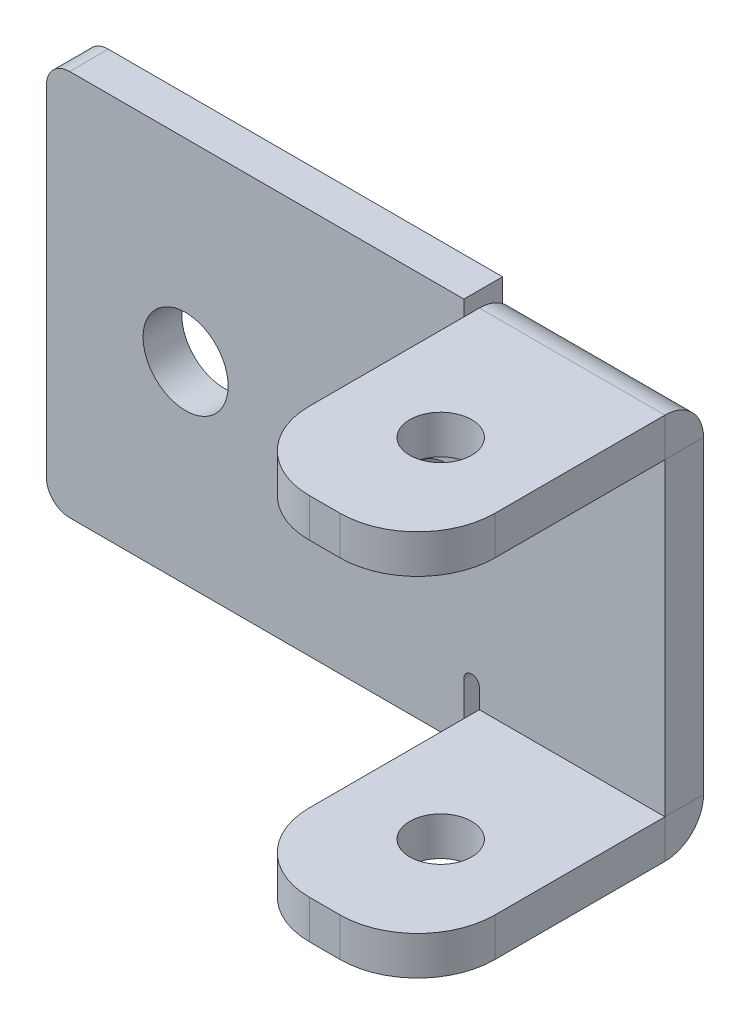
ISO-10303-21;
HEADER;
FILE_DESCRIPTION(('STEP AP214'),'2;1');
FILE_NAME('part.step','',(''),(''),'','','');
FILE_SCHEMA(('AUTOMOTIVE_DESIGN { 1 0 10303 214 1 1 1 1 }'));
ENDSEC;
DATA;
#1=APPLICATION_CONTEXT('core data for automotive mechanical design processes');
#2=APPLICATION_PROTOCOL_DEFINITION('international standard','automotive_design',2000,#1);
#3=PRODUCT_CONTEXT('',#1,'mechanical');
#4=PRODUCT('Part','Part','',(#3));
#5=PRODUCT_RELATED_PRODUCT_CATEGORY('part','',(#4));
#6=PRODUCT_DEFINITION_FORMATION('','',#4);
#7=PRODUCT_DEFINITION_CONTEXT('part definition',#1,'design');
#8=PRODUCT_DEFINITION('design','',#6,#7);
#9=PRODUCT_DEFINITION_SHAPE('','',#8);
#10=(LENGTH_UNIT() NAMED_UNIT(*) SI_UNIT(.MILLI.,.METRE.));
#11=(NAMED_UNIT(*) PLANE_ANGLE_UNIT() SI_UNIT($,.RADIAN.));
#12=(NAMED_UNIT(*) SI_UNIT($,.STERADIAN.) SOLID_ANGLE_UNIT());
#13=UNCERTAINTY_MEASURE_WITH_UNIT(LENGTH_MEASURE(1.E-05),#10,'distance_accuracy_value','');
#14=(GEOMETRIC_REPRESENTATION_CONTEXT(3) GLOBAL_UNCERTAINTY_ASSIGNED_CONTEXT((#13)) GLOBAL_UNIT_ASSIGNED_CONTEXT((#10,
#11,#12)) REPRESENTATION_CONTEXT('',''));
#15=CARTESIAN_POINT('',(0.,0.,0.));
#16=DIRECTION('',(0.,0.,1.));
#17=DIRECTION('',(1.,0.,0.));
#18=AXIS2_PLACEMENT_3D('',#15,#16,#17);
#19=CARTESIAN_POINT('',(20.,-12.5000000000001,16.));
#20=DIRECTION('',(-1.,0.,0.));
#21=DIRECTION('',(0.,0.,1.));
#22=AXIS2_PLACEMENT_3D('',#19,#20,#21);
#23=PLANE('',#22);
#24=DIRECTION('',(0.,-1.,0.));
#25=VECTOR('',#24,1.);
#26=CARTESIAN_POINT('',(20.,12.5,11.0000000000001));
#27=LINE('',#26,#25);
#28=CARTESIAN_POINT('',(20.,-10.,11.));
#29=VERTEX_POINT('',#28);
#30=CARTESIAN_POINT('',(20.,-12.5,11.));
#31=VERTEX_POINT('',#30);
#32=EDGE_CURVE('E93',#29,#31,#27,.T.);
#33=ORIENTED_EDGE('',*,*,#32,.T.);
#34=DIRECTION('',(0.,0.,1.));
#35=VECTOR('',#34,1.);
#36=CARTESIAN_POINT('',(20.,-12.5,0.));
#37=LINE('',#36,#35);
#38=CARTESIAN_POINT('',(20.,-12.5,0.));
#39=VERTEX_POINT('',#38);
#40=EDGE_CURVE('E310',#39,#31,#37,.T.);
#41=ORIENTED_EDGE('',*,*,#40,.F.);
#42=DIRECTION('',(0.,1.,0.));
#43=VECTOR('',#42,1.);
#44=CARTESIAN_POINT('',(20.,-12.5,0.));
#45=LINE('',#44,#43);
#46=CARTESIAN_POINT('',(20.,-10.,0.));
#47=VERTEX_POINT('',#46);
#48=EDGE_CURVE('E304',#39,#47,#45,.T.);
#49=ORIENTED_EDGE('',*,*,#48,.T.);
#50=DIRECTION('',(0.,0.,-1.));
#51=VECTOR('',#50,1.);
#52=CARTESIAN_POINT('',(20.,-10.0000000000001,16.));
#53=LINE('',#52,#51);
#54=EDGE_CURVE('E321',#47,#29,#53,.F.);
#55=ORIENTED_EDGE('',*,*,#54,.T.);
#56=EDGE_LOOP('',(#33,#41,#49,#55));
#57=FACE_BOUND('',#56,.T.);
#58=ADVANCED_FACE('F78',(#57),#23,.F.);
#59=CARTESIAN_POINT('',(7.99999999999999,-12.5000000000001,16.));
#60=DIRECTION('',(0.,0.,-1.));
#61=DIRECTION('',(0.,1.,0.));
#62=AXIS2_PLACEMENT_3D('',#59,#60,#61);
#63=PLANE('',#62);
#64=DIRECTION('',(0.,-1.,0.));
#65=VECTOR('',#64,1.);
#66=CARTESIAN_POINT('',(13.,12.4999999999999,16.0000000000001));
#67=LINE('',#66,#65);
#68=CARTESIAN_POINT('',(13.,-10.0000000000001,16.));
#69=VERTEX_POINT('',#68);
#70=CARTESIAN_POINT('',(13.,-12.5000000000001,16.));
#71=VERTEX_POINT('',#70);
#72=EDGE_CURVE('E101',#69,#71,#67,.T.);
#73=ORIENTED_EDGE('',*,*,#72,.T.);
#74=DIRECTION('',(-1.,0.,0.));
#75=VECTOR('',#74,1.);
#76=CARTESIAN_POINT('',(0.,-12.5000000000001,16.));
#77=LINE('',#76,#75);
#78=CARTESIAN_POINT('',(15.,-12.5000000000001,16.));
#79=VERTEX_POINT('',#78);
#80=EDGE_CURVE('E307',#79,#71,#77,.T.);
#81=ORIENTED_EDGE('',*,*,#80,.F.);
#82=DIRECTION('',(0.,-1.,0.));
#83=VECTOR('',#82,1.);
#84=CARTESIAN_POINT('',(15.,12.4999999999999,16.0000000000001));
#85=LINE('',#84,#83);
#86=CARTESIAN_POINT('',(15.,-10.0000000000001,16.));
#87=VERTEX_POINT('',#86);
#88=EDGE_CURVE('E454',#87,#79,#85,.T.);
#89=ORIENTED_EDGE('',*,*,#88,.F.);
#90=DIRECTION('',(1.,0.,0.));
#91=VECTOR('',#90,1.);
#92=CARTESIAN_POINT('',(7.99999999999999,-10.0000000000001,16.));
#93=LINE('',#92,#91);
#94=EDGE_CURVE('E318',#87,#69,#93,.F.);
#95=ORIENTED_EDGE('',*,*,#94,.T.);
#96=EDGE_LOOP('',(#73,#81,#89,#95));
#97=FACE_BOUND('',#96,.T.);
#98=ADVANCED_FACE('F507',(#97),#63,.F.);
#99=CARTESIAN_POINT('',(20.,12.5,0.));
#100=DIRECTION('',(-1.,0.,0.));
#101=DIRECTION('',(0.,-1.,0.));
#102=AXIS2_PLACEMENT_3D('',#99,#100,#101);
#103=PLANE('',#102);
#104=CARTESIAN_POINT('',(20.,12.5,11.0000000000001));
#105=VERTEX_POINT('',#104);
#106=CARTESIAN_POINT('',(20.,10.,11.0000000000001));
#107=VERTEX_POINT('',#106);
#108=EDGE_CURVE('E447',#105,#107,#27,.T.);
#109=ORIENTED_EDGE('',*,*,#108,.T.);
#110=DIRECTION('',(0.,0.,1.));
#111=VECTOR('',#110,1.);
#112=CARTESIAN_POINT('',(20.,10.,0.));
#113=LINE('',#112,#111);
#114=CARTESIAN_POINT('',(20.,10.,0.));
#115=VERTEX_POINT('',#114);
#116=EDGE_CURVE('E283',#107,#115,#113,.F.);
#117=ORIENTED_EDGE('',*,*,#116,.T.);
#118=DIRECTION('',(0.,-1.,0.));
#119=VECTOR('',#118,1.);
#120=CARTESIAN_POINT('',(20.,12.5,0.));
#121=LINE('',#120,#119);
#122=CARTESIAN_POINT('',(20.,12.5,0.));
#123=VERTEX_POINT('',#122);
#124=EDGE_CURVE('E266',#123,#115,#121,.T.);
#125=ORIENTED_EDGE('',*,*,#124,.F.);
#126=DIRECTION('',(0.,0.,-1.));
#127=VECTOR('',#126,1.);
#128=CARTESIAN_POINT('',(20.,12.5,0.));
#129=LINE('',#128,#127);
#130=EDGE_CURVE('E273',#105,#123,#129,.T.);
#131=ORIENTED_EDGE('',*,*,#130,.F.);
#132=EDGE_LOOP('',(#109,#117,#125,#131));
#133=FACE_BOUND('',#132,.T.);
#134=ADVANCED_FACE('F452',(#133),#103,.F.);
#135=CARTESIAN_POINT('',(20.,12.5000000000001,16.));
#136=DIRECTION('',(0.,0.,-1.));
#137=DIRECTION('',(0.,1.,0.));
#138=AXIS2_PLACEMENT_3D('',#135,#136,#137);
#139=PLANE('',#138);
#140=CARTESIAN_POINT('',(13.,12.4999999999999,16.0000000000001));
#141=VERTEX_POINT('',#140);
#142=CARTESIAN_POINT('',(13.,10.0000000000001,16.0000000000001));
#143=VERTEX_POINT('',#142);
#144=EDGE_CURVE('E237',#141,#143,#67,.T.);
#145=ORIENTED_EDGE('',*,*,#144,.T.);
#146=DIRECTION('',(-1.,0.,0.));
#147=VECTOR('',#146,1.);
#148=CARTESIAN_POINT('',(20.,10.0000000000001,16.));
#149=LINE('',#148,#147);
#150=CARTESIAN_POINT('',(15.,10.0000000000001,16.));
#151=VERTEX_POINT('',#150);
#152=EDGE_CURVE('E275',#143,#151,#149,.F.);
#153=ORIENTED_EDGE('',*,*,#152,.T.);
#154=CARTESIAN_POINT('',(15.,12.4999999999999,16.0000000000001));
#155=VERTEX_POINT('',#154);
#156=EDGE_CURVE('E262',#155,#151,#85,.T.);
#157=ORIENTED_EDGE('',*,*,#156,.F.);
#158=DIRECTION('',(1.,0.,0.));
#159=VECTOR('',#158,1.);
#160=CARTESIAN_POINT('',(0.,12.5000000000001,16.));
#161=LINE('',#160,#159);
#162=EDGE_CURVE('E254',#141,#155,#161,.T.);
#163=ORIENTED_EDGE('',*,*,#162,.F.);
#164=EDGE_LOOP('',(#145,#153,#157,#163));
#165=FACE_BOUND('',#164,.T.);
#166=ADVANCED_FACE('F261',(#165),#139,.F.);
#167=CARTESIAN_POINT('',(-18.5,11.,-2.5));
#168=DIRECTION('',(0.,0.,1.));
#169=DIRECTION('',(1.,0.,0.));
#170=AXIS2_PLACEMENT_3D('',#167,#168,#169);
#171=PLANE('',#170);
#172=CARTESIAN_POINT('',(6.,0.,-2.5));
#173=DIRECTION('',(0.,0.,1.));
#174=DIRECTION('',(1.,0.,0.));
#175=AXIS2_PLACEMENT_3D('',#172,#173,#174);
#176=CIRCLE('',#175,2.75);
#177=CARTESIAN_POINT('',(8.75,0.,-2.5));
#178=VERTEX_POINT('',#177);
#179=EDGE_CURVE('E387',#178,#178,#176,.T.);
#180=ORIENTED_EDGE('',*,*,#179,.T.);
#181=EDGE_LOOP('',(#180));
#182=FACE_BOUND('',#181,.T.);
#183=CARTESIAN_POINT('',(-11.,0.,-2.5));
#184=DIRECTION('',(0.,0.,1.));
#185=DIRECTION('',(1.,0.,0.));
#186=AXIS2_PLACEMENT_3D('',#183,#184,#185);
#187=CIRCLE('',#186,2.75);
#188=CARTESIAN_POINT('',(-8.25,0.,-2.5));
#189=VERTEX_POINT('',#188);
#190=EDGE_CURVE('E393',#189,#189,#187,.T.);
#191=ORIENTED_EDGE('',*,*,#190,.T.);
#192=EDGE_LOOP('',(#191));
#193=FACE_BOUND('',#192,.T.);
#194=DIRECTION('',(0.,1.,0.));
#195=VECTOR('',#194,1.);
#196=CARTESIAN_POINT('',(7.,11.,-2.5));
#197=LINE('',#196,#195);
#198=CARTESIAN_POINT('',(7.,8.75000000000001,-2.5));
#199=VERTEX_POINT('',#198);
#200=CARTESIAN_POINT('',(7.,12.5,-2.5));
#201=VERTEX_POINT('',#200);
#202=EDGE_CURVE('E344',#199,#201,#197,.T.);
#203=ORIENTED_EDGE('',*,*,#202,.F.);
#204=CARTESIAN_POINT('',(7.5,8.75000000000001,-2.5));
#205=DIRECTION('',(0.,0.,1.));
#206=DIRECTION('',(1.,0.,0.));
#207=AXIS2_PLACEMENT_3D('',#204,#205,#206);
#208=CIRCLE('',#207,0.5);
#209=CARTESIAN_POINT('',(8.,8.75000000000001,-2.5));
#210=VERTEX_POINT('',#209);
#211=EDGE_CURVE('E362',#210,#199,#208,.F.);
#212=ORIENTED_EDGE('',*,*,#211,.F.);
#213=DIRECTION('',(0.,-1.,0.));
#214=VECTOR('',#213,1.);
#215=CARTESIAN_POINT('',(8.,11.,-2.5));
#216=LINE('',#215,#214);
#217=CARTESIAN_POINT('',(8.,10.,-2.5));
#218=VERTEX_POINT('',#217);
#219=EDGE_CURVE('E360',#218,#210,#216,.T.);
#220=ORIENTED_EDGE('',*,*,#219,.F.);
#221=DIRECTION('',(-1.,0.,0.));
#222=VECTOR('',#221,1.);
#223=CARTESIAN_POINT('',(0.,9.99999999999993,-2.5));
#224=LINE('',#223,#222);
#225=CARTESIAN_POINT('',(20.,9.99999999999996,-2.5));
#226=VERTEX_POINT('',#225);
#227=EDGE_CURVE('E288',#226,#218,#224,.T.);
#228=ORIENTED_EDGE('',*,*,#227,.F.);
#229=DIRECTION('',(0.,1.,0.));
#230=VECTOR('',#229,1.);
#231=CARTESIAN_POINT('',(20.,-12.5,-2.5));
#232=LINE('',#231,#230);
#233=CARTESIAN_POINT('',(20.,-9.99999999999998,-2.5));
#234=VERTEX_POINT('',#233);
#235=EDGE_CURVE('E399',#234,#226,#232,.T.);
#236=ORIENTED_EDGE('',*,*,#235,.F.);
#237=DIRECTION('',(1.,0.,0.));
#238=VECTOR('',#237,1.);
#239=CARTESIAN_POINT('',(0.,-9.99999999999994,-2.5));
#240=LINE('',#239,#238);
#241=CARTESIAN_POINT('',(7.99999999999999,-9.99999999999996,-2.5));
#242=VERTEX_POINT('',#241);
#243=EDGE_CURVE('E329',#242,#234,#240,.T.);
#244=ORIENTED_EDGE('',*,*,#243,.F.);
#245=DIRECTION('',(0.,-1.,0.));
#246=VECTOR('',#245,1.);
#247=CARTESIAN_POINT('',(7.99999999999999,11.,-2.5));
#248=LINE('',#247,#246);
#249=CARTESIAN_POINT('',(7.99999999999999,-8.74999999999999,-2.5));
#250=VERTEX_POINT('',#249);
#251=EDGE_CURVE('E383',#250,#242,#248,.T.);
#252=ORIENTED_EDGE('',*,*,#251,.F.);
#253=CARTESIAN_POINT('',(7.49999999999999,-8.74999999999999,-2.5));
#254=DIRECTION('',(0.,0.,1.));
#255=DIRECTION('',(1.,0.,0.));
#256=AXIS2_PLACEMENT_3D('',#253,#254,#255);
#257=CIRCLE('',#256,0.5);
#258=CARTESIAN_POINT('',(6.99999999999999,-8.74999999999999,-2.5));
#259=VERTEX_POINT('',#258);
#260=EDGE_CURVE('E381',#259,#250,#257,.F.);
#261=ORIENTED_EDGE('',*,*,#260,.F.);
#262=DIRECTION('',(0.,1.,0.));
#263=VECTOR('',#262,1.);
#264=CARTESIAN_POINT('',(6.99999999999999,11.,-2.5));
#265=LINE('',#264,#263);
#266=CARTESIAN_POINT('',(6.99999999999999,-12.5,-2.5));
#267=VERTEX_POINT('',#266);
#268=EDGE_CURVE('E368',#267,#259,#265,.T.);
#269=ORIENTED_EDGE('',*,*,#268,.F.);
#270=DIRECTION('',(1.,0.,0.));
#271=VECTOR('',#270,1.);
#272=CARTESIAN_POINT('',(20.,-12.5,-2.5));
#273=LINE('',#272,#271);
#274=CARTESIAN_POINT('',(-18.5,-12.5,-2.5));
#275=VERTEX_POINT('',#274);
#276=EDGE_CURVE('E413',#275,#267,#273,.T.);
#277=ORIENTED_EDGE('',*,*,#276,.F.);
#278=CARTESIAN_POINT('',(-18.5,-11.,-2.5));
#279=DIRECTION('',(0.,0.,1.));
#280=DIRECTION('',(-1.,0.,0.));
#281=AXIS2_PLACEMENT_3D('',#278,#279,#280);
#282=CIRCLE('',#281,1.5);
#283=CARTESIAN_POINT('',(-20.,-11.,-2.5));
#284=VERTEX_POINT('',#283);
#285=EDGE_CURVE('E410',#284,#275,#282,.T.);
#286=ORIENTED_EDGE('',*,*,#285,.F.);
#287=DIRECTION('',(0.,-1.,0.));
#288=VECTOR('',#287,1.);
#289=CARTESIAN_POINT('',(-20.,-11.,-2.5));
#290=LINE('',#289,#288);
#291=CARTESIAN_POINT('',(-20.,11.,-2.5));
#292=VERTEX_POINT('',#291);
#293=EDGE_CURVE('E407',#292,#284,#290,.T.);
#294=ORIENTED_EDGE('',*,*,#293,.F.);
#295=CARTESIAN_POINT('',(-18.5,11.,-2.5));
#296=DIRECTION('',(0.,0.,1.));
#297=DIRECTION('',(1.,0.,0.));
#298=AXIS2_PLACEMENT_3D('',#295,#296,#297);
#299=CIRCLE('',#298,1.5);
#300=CARTESIAN_POINT('',(-18.5,12.5,-2.5));
#301=VERTEX_POINT('',#300);
#302=EDGE_CURVE('E404',#301,#292,#299,.T.);
#303=ORIENTED_EDGE('',*,*,#302,.F.);
#304=DIRECTION('',(-1.,0.,0.));
#305=VECTOR('',#304,1.);
#306=CARTESIAN_POINT('',(20.,12.5,-2.5));
#307=LINE('',#306,#305);
#308=EDGE_CURVE('E401',#201,#301,#307,.T.);
#309=ORIENTED_EDGE('',*,*,#308,.F.);
#310=EDGE_LOOP('',(#203,#212,#220,#228,#236,#244,#252,#261,#269,#277,#286,#294,#303,#309));
#311=FACE_BOUND('',#310,.T.);
#312=ADVANCED_FACE('F546',(#182,#193,#311),#171,.F.);
#313=CARTESIAN_POINT('',(-18.5,11.,0.));
#314=DIRECTION('',(0.,0.,1.));
#315=DIRECTION('',(1.,0.,0.));
#316=AXIS2_PLACEMENT_3D('',#313,#314,#315);
#317=PLANE('',#316);
#318=CARTESIAN_POINT('',(6.,0.,0.));
#319=DIRECTION('',(0.,0.,1.));
#320=DIRECTION('',(1.,0.,0.));
#321=AXIS2_PLACEMENT_3D('',#318,#319,#320);
#322=CIRCLE('',#321,2.75);
#323=CARTESIAN_POINT('',(8.75,0.,0.));
#324=VERTEX_POINT('',#323);
#325=EDGE_CURVE('E386',#324,#324,#322,.T.);
#326=ORIENTED_EDGE('',*,*,#325,.F.);
#327=EDGE_LOOP('',(#326));
#328=FACE_BOUND('',#327,.T.);
#329=CARTESIAN_POINT('',(-11.,0.,0.));
#330=DIRECTION('',(0.,0.,1.));
#331=DIRECTION('',(1.,0.,0.));
#332=AXIS2_PLACEMENT_3D('',#329,#330,#331);
#333=CIRCLE('',#332,2.75);
#334=CARTESIAN_POINT('',(-8.25,0.,0.));
#335=VERTEX_POINT('',#334);
#336=EDGE_CURVE('E390',#335,#335,#333,.T.);
#337=ORIENTED_EDGE('',*,*,#336,.F.);
#338=EDGE_LOOP('',(#337));
#339=FACE_BOUND('',#338,.T.);
#340=CARTESIAN_POINT('',(7.5,8.75,0.));
#341=DIRECTION('',(0.,0.,1.));
#342=DIRECTION('',(1.,0.,0.));
#343=AXIS2_PLACEMENT_3D('',#340,#341,#342);
#344=CIRCLE('',#343,0.5);
#345=CARTESIAN_POINT('',(7.,8.75,0.));
#346=VERTEX_POINT('',#345);
#347=CARTESIAN_POINT('',(8.,8.75,0.));
#348=VERTEX_POINT('',#347);
#349=EDGE_CURVE('E346',#346,#348,#344,.T.);
#350=ORIENTED_EDGE('',*,*,#349,.F.);
#351=DIRECTION('',(0.,-1.,0.));
#352=VECTOR('',#351,1.);
#353=CARTESIAN_POINT('',(7.,12.5,0.));
#354=LINE('',#353,#352);
#355=CARTESIAN_POINT('',(7.,12.5,0.));
#356=VERTEX_POINT('',#355);
#357=EDGE_CURVE('E341',#356,#346,#354,.T.);
#358=ORIENTED_EDGE('',*,*,#357,.F.);
#359=DIRECTION('',(-1.,0.,0.));
#360=VECTOR('',#359,1.);
#361=CARTESIAN_POINT('',(20.,12.5,0.));
#362=LINE('',#361,#360);
#363=CARTESIAN_POINT('',(-18.5,12.5,0.));
#364=VERTEX_POINT('',#363);
#365=EDGE_CURVE('E419',#356,#364,#362,.T.);
#366=ORIENTED_EDGE('',*,*,#365,.T.);
#367=CARTESIAN_POINT('',(-18.5,11.,0.));
#368=DIRECTION('',(0.,0.,1.));
#369=DIRECTION('',(1.,0.,0.));
#370=AXIS2_PLACEMENT_3D('',#367,#368,#369);
#371=CIRCLE('',#370,1.5);
#372=CARTESIAN_POINT('',(-20.,11.,0.));
#373=VERTEX_POINT('',#372);
#374=EDGE_CURVE('E421',#364,#373,#371,.T.);
#375=ORIENTED_EDGE('',*,*,#374,.T.);
#376=DIRECTION('',(0.,-1.,0.));
#377=VECTOR('',#376,1.);
#378=CARTESIAN_POINT('',(-20.,-11.,0.));
#379=LINE('',#378,#377);
#380=CARTESIAN_POINT('',(-20.,-11.,0.));
#381=VERTEX_POINT('',#380);
#382=EDGE_CURVE('E424',#373,#381,#379,.T.);
#383=ORIENTED_EDGE('',*,*,#382,.T.);
#384=CARTESIAN_POINT('',(-18.5,-11.,0.));
#385=DIRECTION('',(0.,0.,1.));
#386=DIRECTION('',(-1.,0.,0.));
#387=AXIS2_PLACEMENT_3D('',#384,#385,#386);
#388=CIRCLE('',#387,1.5);
#389=CARTESIAN_POINT('',(-18.5,-12.5,0.));
#390=VERTEX_POINT('',#389);
#391=EDGE_CURVE('E427',#381,#390,#388,.T.);
#392=ORIENTED_EDGE('',*,*,#391,.T.);
#393=DIRECTION('',(1.,0.,0.));
#394=VECTOR('',#393,1.);
#395=CARTESIAN_POINT('',(20.,-12.5,0.));
#396=LINE('',#395,#394);
#397=CARTESIAN_POINT('',(6.99999999999999,-12.5,0.));
#398=VERTEX_POINT('',#397);
#399=EDGE_CURVE('E402',#390,#398,#396,.T.);
#400=ORIENTED_EDGE('',*,*,#399,.T.);
#401=DIRECTION('',(0.,-1.,0.));
#402=VECTOR('',#401,1.);
#403=CARTESIAN_POINT('',(6.99999999999999,-8.75,0.));
#404=LINE('',#403,#402);
#405=CARTESIAN_POINT('',(6.99999999999999,-8.74999999999999,0.));
#406=VERTEX_POINT('',#405);
#407=EDGE_CURVE('E372',#406,#398,#404,.T.);
#408=ORIENTED_EDGE('',*,*,#407,.F.);
#409=CARTESIAN_POINT('',(7.49999999999999,-8.75,0.));
#410=DIRECTION('',(0.,0.,1.));
#411=DIRECTION('',(1.,0.,0.));
#412=AXIS2_PLACEMENT_3D('',#409,#410,#411);
#413=CIRCLE('',#412,0.5);
#414=CARTESIAN_POINT('',(7.99999999999999,-8.75,0.));
#415=VERTEX_POINT('',#414);
#416=EDGE_CURVE('E369',#415,#406,#413,.T.);
#417=ORIENTED_EDGE('',*,*,#416,.F.);
#418=DIRECTION('',(0.,1.,0.));
#419=VECTOR('',#418,1.);
#420=CARTESIAN_POINT('',(7.99999999999999,-10.,0.));
#421=LINE('',#420,#419);
#422=CARTESIAN_POINT('',(7.99999999999999,-10.,0.));
#423=VERTEX_POINT('',#422);
#424=EDGE_CURVE('E365',#423,#415,#421,.T.);
#425=ORIENTED_EDGE('',*,*,#424,.F.);
#426=DIRECTION('',(-1.,0.,0.));
#427=VECTOR('',#426,1.);
#428=CARTESIAN_POINT('',(7.99999999999999,-10.,0.));
#429=LINE('',#428,#427);
#430=EDGE_CURVE('E324',#423,#47,#429,.F.);
#431=ORIENTED_EDGE('',*,*,#430,.T.);
#432=DIRECTION('',(0.,1.,0.));
#433=VECTOR('',#432,1.);
#434=CARTESIAN_POINT('',(20.,-12.5,0.));
#435=LINE('',#434,#433);
#436=EDGE_CURVE('E396',#47,#115,#435,.T.);
#437=ORIENTED_EDGE('',*,*,#436,.T.);
#438=DIRECTION('',(1.,0.,0.));
#439=VECTOR('',#438,1.);
#440=CARTESIAN_POINT('',(20.,10.,0.));
#441=LINE('',#440,#439);
#442=CARTESIAN_POINT('',(8.,10.,0.));
#443=VERTEX_POINT('',#442);
#444=EDGE_CURVE('E280',#115,#443,#441,.F.);
#445=ORIENTED_EDGE('',*,*,#444,.T.);
#446=DIRECTION('',(0.,1.,0.));
#447=VECTOR('',#446,1.);
#448=CARTESIAN_POINT('',(8.,8.75,0.));
#449=LINE('',#448,#447);
#450=EDGE_CURVE('E350',#348,#443,#449,.T.);
#451=ORIENTED_EDGE('',*,*,#450,.F.);
#452=EDGE_LOOP('',(#350,#358,#366,#375,#383,#392,#400,#408,#417,#425,#431,#437,#445,#451));
#453=FACE_BOUND('',#452,.T.);
#454=ADVANCED_FACE('F463',(#328,#339,#453),#317,.T.);
#455=CARTESIAN_POINT('',(20.,12.5,-2.5));
#456=DIRECTION('',(0.,1.,0.));
#457=DIRECTION('',(-1.,0.,0.));
#458=AXIS2_PLACEMENT_3D('',#455,#456,#457);
#459=PLANE('',#458);
#460=ORIENTED_EDGE('',*,*,#365,.F.);
#461=DIRECTION('',(0.,0.,-1.));
#462=VECTOR('',#461,1.);
#463=CARTESIAN_POINT('',(7.,12.5,0.));
#464=LINE('',#463,#462);
#465=EDGE_CURVE('E345',#356,#201,#464,.T.);
#466=ORIENTED_EDGE('',*,*,#465,.T.);
#467=ORIENTED_EDGE('',*,*,#308,.T.);
#468=DIRECTION('',(0.,0.,1.));
#469=VECTOR('',#468,1.);
#470=CARTESIAN_POINT('',(-18.5,12.5,-2.5));
#471=LINE('',#470,#469);
#472=EDGE_CURVE('E416',#301,#364,#471,.T.);
#473=ORIENTED_EDGE('',*,*,#472,.T.);
#474=EDGE_LOOP('',(#460,#466,#467,#473));
#475=FACE_BOUND('',#474,.T.);
#476=ADVANCED_FACE('F556',(#475),#459,.T.);
#477=CARTESIAN_POINT('',(20.,-12.5,-2.5));
#478=DIRECTION('',(1.,0.,0.));
#479=DIRECTION('',(0.,1.,0.));
#480=AXIS2_PLACEMENT_3D('',#477,#478,#479);
#481=PLANE('',#480);
#482=DIRECTION('',(0.,0.,1.));
#483=VECTOR('',#482,1.);
#484=CARTESIAN_POINT('',(20.,9.99999999999998,-2.5));
#485=LINE('',#484,#483);
#486=EDGE_CURVE('E291',#226,#115,#485,.T.);
#487=ORIENTED_EDGE('',*,*,#486,.T.);
#488=ORIENTED_EDGE('',*,*,#436,.F.);
#489=DIRECTION('',(0.,0.,1.));
#490=VECTOR('',#489,1.);
#491=CARTESIAN_POINT('',(20.,-9.99999999999998,-2.5));
#492=LINE('',#491,#490);
#493=EDGE_CURVE('E303',#234,#47,#492,.T.);
#494=ORIENTED_EDGE('',*,*,#493,.F.);
#495=ORIENTED_EDGE('',*,*,#235,.T.);
#496=EDGE_LOOP('',(#487,#488,#494,#495));
#497=FACE_BOUND('',#496,.T.);
#498=ADVANCED_FACE('F80',(#497),#481,.T.);
#499=CARTESIAN_POINT('',(20.,-12.5,-2.5));
#500=DIRECTION('',(0.,-1.,0.));
#501=DIRECTION('',(1.,0.,0.));
#502=AXIS2_PLACEMENT_3D('',#499,#500,#501);
#503=PLANE('',#502);
#504=ORIENTED_EDGE('',*,*,#276,.T.);
#505=DIRECTION('',(0.,0.,-1.));
#506=VECTOR('',#505,1.);
#507=CARTESIAN_POINT('',(6.99999999999999,-12.5,0.));
#508=LINE('',#507,#506);
#509=EDGE_CURVE('E374',#398,#267,#508,.T.);
#510=ORIENTED_EDGE('',*,*,#509,.F.);
#511=ORIENTED_EDGE('',*,*,#399,.F.);
#512=DIRECTION('',(0.,0.,1.));
#513=VECTOR('',#512,1.);
#514=CARTESIAN_POINT('',(-18.5,-12.5,-2.5));
#515=LINE('',#514,#513);
#516=EDGE_CURVE('E432',#275,#390,#515,.T.);
#517=ORIENTED_EDGE('',*,*,#516,.F.);
#518=EDGE_LOOP('',(#504,#510,#511,#517));
#519=FACE_BOUND('',#518,.T.);
#520=ADVANCED_FACE('F574',(#519),#503,.T.);
#521=CARTESIAN_POINT('',(-18.5,-11.,-2.5));
#522=DIRECTION('',(0.,0.,1.));
#523=DIRECTION('',(1.,0.,0.));
#524=AXIS2_PLACEMENT_3D('',#521,#522,#523);
#525=CYLINDRICAL_SURFACE('',#524,1.5);
#526=ORIENTED_EDGE('',*,*,#391,.F.);
#527=DIRECTION('',(0.,0.,1.));
#528=VECTOR('',#527,1.);
#529=CARTESIAN_POINT('',(-20.,-11.,-2.5));
#530=LINE('',#529,#528);
#531=EDGE_CURVE('E434',#284,#381,#530,.T.);
#532=ORIENTED_EDGE('',*,*,#531,.F.);
#533=ORIENTED_EDGE('',*,*,#285,.T.);
#534=ORIENTED_EDGE('',*,*,#516,.T.);
#535=EDGE_LOOP('',(#526,#532,#533,#534));
#536=FACE_BOUND('',#535,.T.);
#537=ADVANCED_FACE('F571',(#536),#525,.T.);
#538=CARTESIAN_POINT('',(-20.,-11.,-2.5));
#539=DIRECTION('',(-1.,0.,0.));
#540=DIRECTION('',(0.,0.,1.));
#541=AXIS2_PLACEMENT_3D('',#538,#539,#540);
#542=PLANE('',#541);
#543=ORIENTED_EDGE('',*,*,#382,.F.);
#544=DIRECTION('',(0.,0.,1.));
#545=VECTOR('',#544,1.);
#546=CARTESIAN_POINT('',(-20.,11.,-2.5));
#547=LINE('',#546,#545);
#548=EDGE_CURVE('E436',#292,#373,#547,.T.);
#549=ORIENTED_EDGE('',*,*,#548,.F.);
#550=ORIENTED_EDGE('',*,*,#293,.T.);
#551=ORIENTED_EDGE('',*,*,#531,.T.);
#552=EDGE_LOOP('',(#543,#549,#550,#551));
#553=FACE_BOUND('',#552,.T.);
#554=ADVANCED_FACE('F567',(#553),#542,.T.);
#555=CARTESIAN_POINT('',(-18.5,11.,-2.5));
#556=DIRECTION('',(0.,0.,1.));
#557=DIRECTION('',(1.,0.,0.));
#558=AXIS2_PLACEMENT_3D('',#555,#556,#557);
#559=CYLINDRICAL_SURFACE('',#558,1.5);
#560=ORIENTED_EDGE('',*,*,#374,.F.);
#561=ORIENTED_EDGE('',*,*,#472,.F.);
#562=ORIENTED_EDGE('',*,*,#302,.T.);
#563=ORIENTED_EDGE('',*,*,#548,.T.);
#564=EDGE_LOOP('',(#560,#561,#562,#563));
#565=FACE_BOUND('',#564,.T.);
#566=ADVANCED_FACE('F562',(#565),#559,.T.);
#567=CARTESIAN_POINT('',(-11.,0.,-2.5));
#568=DIRECTION('',(0.,0.,1.));
#569=DIRECTION('',(1.,0.,0.));
#570=AXIS2_PLACEMENT_3D('',#567,#568,#569);
#571=CYLINDRICAL_SURFACE('',#570,2.75);
#572=ORIENTED_EDGE('',*,*,#190,.F.);
#573=EDGE_LOOP('',(#572));
#574=FACE_BOUND('',#573,.T.);
#575=ORIENTED_EDGE('',*,*,#336,.T.);
#576=EDGE_LOOP('',(#575));
#577=FACE_BOUND('',#576,.T.);
#578=ADVANCED_FACE('F906',(#574,#577),#571,.F.);
#579=CARTESIAN_POINT('',(6.,0.,-2.5));
#580=DIRECTION('',(0.,0.,1.));
#581=DIRECTION('',(1.,0.,0.));
#582=AXIS2_PLACEMENT_3D('',#579,#580,#581);
#583=CYLINDRICAL_SURFACE('',#582,2.75);
#584=ORIENTED_EDGE('',*,*,#179,.F.);
#585=EDGE_LOOP('',(#584));
#586=FACE_BOUND('',#585,.T.);
#587=ORIENTED_EDGE('',*,*,#325,.T.);
#588=EDGE_LOOP('',(#587));
#589=FACE_BOUND('',#588,.T.);
#590=ADVANCED_FACE('F588',(#586,#589),#583,.F.);
#591=CARTESIAN_POINT('',(7.99999999999999,-10.,0.));
#592=DIRECTION('',(-1.,0.,0.));
#593=DIRECTION('',(0.,0.,1.));
#594=AXIS2_PLACEMENT_3D('',#591,#592,#593);
#595=PLANE('',#594);
#596=DIRECTION('',(0.,0.,-1.));
#597=VECTOR('',#596,1.);
#598=CARTESIAN_POINT('',(7.99999999999999,-8.75,0.));
#599=LINE('',#598,#597);
#600=EDGE_CURVE('E371',#415,#250,#599,.T.);
#601=ORIENTED_EDGE('',*,*,#600,.T.);
#602=ORIENTED_EDGE('',*,*,#251,.T.);
#603=DIRECTION('',(0.,0.,1.));
#604=VECTOR('',#603,1.);
#605=CARTESIAN_POINT('',(7.99999999999999,-9.99999999999999,-2.5));
#606=LINE('',#605,#604);
#607=EDGE_CURVE('E332',#242,#423,#606,.T.);
#608=ORIENTED_EDGE('',*,*,#607,.T.);
#609=ORIENTED_EDGE('',*,*,#424,.T.);
#610=EDGE_LOOP('',(#601,#602,#608,#609));
#611=FACE_BOUND('',#610,.T.);
#612=ADVANCED_FACE('F541',(#611),#595,.T.);
#613=CARTESIAN_POINT('',(7.49999999999999,-8.75,0.));
#614=DIRECTION('',(0.,0.,-1.));
#615=DIRECTION('',(0.,1.,0.));
#616=AXIS2_PLACEMENT_3D('',#613,#614,#615);
#617=CYLINDRICAL_SURFACE('',#616,0.5);
#618=DIRECTION('',(0.,0.,-1.));
#619=VECTOR('',#618,1.);
#620=CARTESIAN_POINT('',(6.99999999999999,-8.75,0.));
#621=LINE('',#620,#619);
#622=EDGE_CURVE('E364',#406,#259,#621,.T.);
#623=ORIENTED_EDGE('',*,*,#622,.T.);
#624=ORIENTED_EDGE('',*,*,#260,.T.);
#625=ORIENTED_EDGE('',*,*,#600,.F.);
#626=ORIENTED_EDGE('',*,*,#416,.T.);
#627=EDGE_LOOP('',(#623,#624,#625,#626));
#628=FACE_BOUND('',#627,.T.);
#629=ADVANCED_FACE('F580',(#628),#617,.F.);
#630=CARTESIAN_POINT('',(6.99999999999999,-8.75,0.));
#631=DIRECTION('',(1.,0.,0.));
#632=DIRECTION('',(0.,1.,0.));
#633=AXIS2_PLACEMENT_3D('',#630,#631,#632);
#634=PLANE('',#633);
#635=ORIENTED_EDGE('',*,*,#509,.T.);
#636=ORIENTED_EDGE('',*,*,#268,.T.);
#637=ORIENTED_EDGE('',*,*,#622,.F.);
#638=ORIENTED_EDGE('',*,*,#407,.T.);
#639=EDGE_LOOP('',(#635,#636,#637,#638));
#640=FACE_BOUND('',#639,.T.);
#641=ADVANCED_FACE('F578',(#640),#634,.T.);
#642=CARTESIAN_POINT('',(7.5,8.75,0.));
#643=DIRECTION('',(0.,0.,-1.));
#644=DIRECTION('',(0.,1.,0.));
#645=AXIS2_PLACEMENT_3D('',#642,#643,#644);
#646=CYLINDRICAL_SURFACE('',#645,0.5);
#647=DIRECTION('',(0.,0.,-1.));
#648=VECTOR('',#647,1.);
#649=CARTESIAN_POINT('',(8.,8.75,0.));
#650=LINE('',#649,#648);
#651=EDGE_CURVE('E340',#348,#210,#650,.T.);
#652=ORIENTED_EDGE('',*,*,#651,.T.);
#653=ORIENTED_EDGE('',*,*,#211,.T.);
#654=DIRECTION('',(0.,0.,-1.));
#655=VECTOR('',#654,1.);
#656=CARTESIAN_POINT('',(7.,8.75,0.));
#657=LINE('',#656,#655);
#658=EDGE_CURVE('E349',#346,#199,#657,.T.);
#659=ORIENTED_EDGE('',*,*,#658,.F.);
#660=ORIENTED_EDGE('',*,*,#349,.T.);
#661=EDGE_LOOP('',(#652,#653,#659,#660));
#662=FACE_BOUND('',#661,.T.);
#663=ADVANCED_FACE('F551',(#662),#646,.F.);
#664=CARTESIAN_POINT('',(8.,8.75,0.));
#665=DIRECTION('',(-1.,0.,0.));
#666=DIRECTION('',(0.,0.,1.));
#667=AXIS2_PLACEMENT_3D('',#664,#665,#666);
#668=PLANE('',#667);
#669=DIRECTION('',(0.,0.,1.));
#670=VECTOR('',#669,1.);
#671=CARTESIAN_POINT('',(8.,9.99999999999998,-2.5));
#672=LINE('',#671,#670);
#673=EDGE_CURVE('E286',#218,#443,#672,.T.);
#674=ORIENTED_EDGE('',*,*,#673,.F.);
#675=ORIENTED_EDGE('',*,*,#219,.T.);
#676=ORIENTED_EDGE('',*,*,#651,.F.);
#677=ORIENTED_EDGE('',*,*,#450,.T.);
#678=EDGE_LOOP('',(#674,#675,#676,#677));
#679=FACE_BOUND('',#678,.T.);
#680=ADVANCED_FACE('F467',(#679),#668,.T.);
#681=CARTESIAN_POINT('',(7.,12.5,0.));
#682=DIRECTION('',(1.,0.,0.));
#683=DIRECTION('',(0.,1.,0.));
#684=AXIS2_PLACEMENT_3D('',#681,#682,#683);
#685=PLANE('',#684);
#686=ORIENTED_EDGE('',*,*,#658,.T.);
#687=ORIENTED_EDGE('',*,*,#202,.T.);
#688=ORIENTED_EDGE('',*,*,#465,.F.);
#689=ORIENTED_EDGE('',*,*,#357,.T.);
#690=EDGE_LOOP('',(#686,#687,#688,#689));
#691=FACE_BOUND('',#690,.T.);
#692=ADVANCED_FACE('F606',(#691),#685,.T.);
#693=CARTESIAN_POINT('',(20.,-9.99999999999998,-2.5));
#694=DIRECTION('',(1.,0.,0.));
#695=DIRECTION('',(0.,1.,0.));
#696=AXIS2_PLACEMENT_3D('',#693,#694,#695);
#697=PLANE('',#696);
#698=CARTESIAN_POINT('',(20.,-10.,0.));
#699=DIRECTION('',(-1.,0.,0.));
#700=DIRECTION('',(0.,-1.,0.));
#701=AXIS2_PLACEMENT_3D('',#698,#699,#700);
#702=CIRCLE('',#701,2.5);
#703=EDGE_CURVE('E338',#234,#39,#702,.T.);
#704=ORIENTED_EDGE('',*,*,#703,.F.);
#705=ORIENTED_EDGE('',*,*,#493,.T.);
#706=ORIENTED_EDGE('',*,*,#48,.F.);
#707=EDGE_LOOP('',(#704,#705,#706));
#708=FACE_BOUND('',#707,.T.);
#709=ADVANCED_FACE('F534',(#708),#697,.T.);
#710=CARTESIAN_POINT('',(7.99999999999999,-10.,0.));
#711=DIRECTION('',(-1.,0.,0.));
#712=DIRECTION('',(0.,-1.,0.));
#713=AXIS2_PLACEMENT_3D('',#710,#711,#712);
#714=CYLINDRICAL_SURFACE('',#713,2.5);
#715=CARTESIAN_POINT('',(7.99999999999999,-10.,0.));
#716=DIRECTION('',(-1.,0.,0.));
#717=DIRECTION('',(0.,-1.,0.));
#718=AXIS2_PLACEMENT_3D('',#715,#716,#717);
#719=CIRCLE('',#718,2.5);
#720=CARTESIAN_POINT('',(7.99999999999999,-12.5,0.));
#721=VERTEX_POINT('',#720);
#722=EDGE_CURVE('E335',#242,#721,#719,.T.);
#723=ORIENTED_EDGE('',*,*,#722,.F.);
#724=ORIENTED_EDGE('',*,*,#243,.T.);
#725=ORIENTED_EDGE('',*,*,#703,.T.);
#726=DIRECTION('',(1.,0.,0.));
#727=VECTOR('',#726,1.);
#728=CARTESIAN_POINT('',(0.,-12.5,0.));
#729=LINE('',#728,#727);
#730=EDGE_CURVE('E313',#721,#39,#729,.T.);
#731=ORIENTED_EDGE('',*,*,#730,.F.);
#732=EDGE_LOOP('',(#723,#724,#725,#731));
#733=FACE_BOUND('',#732,.T.);
#734=ADVANCED_FACE('F531',(#733),#714,.T.);
#735=CARTESIAN_POINT('',(7.99999999999999,-9.99999999999999,-2.5));
#736=DIRECTION('',(1.,0.,0.));
#737=DIRECTION('',(0.,1.,0.));
#738=AXIS2_PLACEMENT_3D('',#735,#736,#737);
#739=PLANE('',#738);
#740=ORIENTED_EDGE('',*,*,#607,.F.);
#741=ORIENTED_EDGE('',*,*,#722,.T.);
#742=DIRECTION('',(0.,1.,0.));
#743=VECTOR('',#742,1.);
#744=CARTESIAN_POINT('',(7.99999999999999,-12.5,0.));
#745=LINE('',#744,#743);
#746=EDGE_CURVE('E300',#721,#423,#745,.T.);
#747=ORIENTED_EDGE('',*,*,#746,.T.);
#748=EDGE_LOOP('',(#740,#741,#747));
#749=FACE_BOUND('',#748,.T.);
#750=ADVANCED_FACE('F529',(#749),#739,.F.);
#751=CARTESIAN_POINT('',(7.99999999999999,-12.5,0.));
#752=DIRECTION('',(1.,0.,0.));
#753=DIRECTION('',(0.,1.,0.));
#754=AXIS2_PLACEMENT_3D('',#751,#752,#753);
#755=PLANE('',#754);
#756=DIRECTION('',(0.,0.,-1.));
#757=VECTOR('',#756,1.);
#758=CARTESIAN_POINT('',(7.99999999999999,-12.5,0.));
#759=LINE('',#758,#757);
#760=CARTESIAN_POINT('',(7.99999999999999,-12.5,11.));
#761=VERTEX_POINT('',#760);
#762=EDGE_CURVE('E316',#761,#721,#759,.T.);
#763=ORIENTED_EDGE('',*,*,#762,.F.);
#764=DIRECTION('',(0.,-1.,0.));
#765=VECTOR('',#764,1.);
#766=CARTESIAN_POINT('',(7.99999999999999,12.5,11.0000000000001));
#767=LINE('',#766,#765);
#768=CARTESIAN_POINT('',(7.99999999999999,-10.,11.));
#769=VERTEX_POINT('',#768);
#770=EDGE_CURVE('E247',#769,#761,#767,.T.);
#771=ORIENTED_EDGE('',*,*,#770,.F.);
#772=DIRECTION('',(0.,0.,1.));
#773=VECTOR('',#772,1.);
#774=CARTESIAN_POINT('',(7.99999999999999,-10.,0.));
#775=LINE('',#774,#773);
#776=EDGE_CURVE('E299',#769,#423,#775,.F.);
#777=ORIENTED_EDGE('',*,*,#776,.T.);
#778=ORIENTED_EDGE('',*,*,#746,.F.);
#779=EDGE_LOOP('',(#763,#771,#777,#778));
#780=FACE_BOUND('',#779,.T.);
#781=ADVANCED_FACE('F523',(#780),#755,.F.);
#782=CARTESIAN_POINT('',(0.,-12.5,0.));
#783=DIRECTION('',(0.,1.,0.));
#784=DIRECTION('',(0.,0.,1.));
#785=AXIS2_PLACEMENT_3D('',#782,#783,#784);
#786=PLANE('',#785);
#787=CARTESIAN_POINT('',(14.,-12.5,8.49999999999999));
#788=DIRECTION('',(0.,-1.,0.));
#789=DIRECTION('',(0.,0.,-1.));
#790=AXIS2_PLACEMENT_3D('',#787,#788,#789);
#791=CIRCLE('',#790,2.);
#792=CARTESIAN_POINT('',(14.,-12.5,6.49999999999999));
#793=VERTEX_POINT('',#792);
#794=EDGE_CURVE('E484',#793,#793,#791,.T.);
#795=ORIENTED_EDGE('',*,*,#794,.F.);
#796=EDGE_LOOP('',(#795));
#797=FACE_BOUND('',#796,.T.);
#798=ORIENTED_EDGE('',*,*,#80,.T.);
#799=CARTESIAN_POINT('',(13.,-12.5,11.));
#800=DIRECTION('',(0.,1.,0.));
#801=DIRECTION('',(0.,0.,-1.));
#802=AXIS2_PLACEMENT_3D('',#799,#800,#801);
#803=CIRCLE('',#802,5.);
#804=EDGE_CURVE('E258',#761,#71,#803,.T.);
#805=ORIENTED_EDGE('',*,*,#804,.F.);
#806=ORIENTED_EDGE('',*,*,#762,.T.);
#807=ORIENTED_EDGE('',*,*,#730,.T.);
#808=ORIENTED_EDGE('',*,*,#40,.T.);
#809=CARTESIAN_POINT('',(15.,-12.5,11.));
#810=DIRECTION('',(0.,1.,0.));
#811=DIRECTION('',(0.,0.,-1.));
#812=AXIS2_PLACEMENT_3D('',#809,#810,#811);
#813=CIRCLE('',#812,5.);
#814=EDGE_CURVE('E495',#79,#31,#813,.T.);
#815=ORIENTED_EDGE('',*,*,#814,.F.);
#816=EDGE_LOOP('',(#798,#805,#806,#807,#808,#815));
#817=FACE_BOUND('',#816,.T.);
#818=ADVANCED_FACE('F511',(#797,#817),#786,.F.);
#819=CARTESIAN_POINT('',(0.,-10.,0.));
#820=DIRECTION('',(0.,1.,0.));
#821=DIRECTION('',(0.,0.,1.));
#822=AXIS2_PLACEMENT_3D('',#819,#820,#821);
#823=PLANE('',#822);
#824=CARTESIAN_POINT('',(13.,-10.,11.));
#825=DIRECTION('',(0.,1.,0.));
#826=DIRECTION('',(0.,0.,1.));
#827=AXIS2_PLACEMENT_3D('',#824,#825,#826);
#828=CIRCLE('',#827,5.);
#829=EDGE_CURVE('E487',#69,#769,#828,.F.);
#830=ORIENTED_EDGE('',*,*,#829,.F.);
#831=ORIENTED_EDGE('',*,*,#94,.F.);
#832=CARTESIAN_POINT('',(15.,-10.,11.));
#833=DIRECTION('',(0.,1.,0.));
#834=DIRECTION('',(0.,0.,1.));
#835=AXIS2_PLACEMENT_3D('',#832,#833,#834);
#836=CIRCLE('',#835,5.);
#837=EDGE_CURVE('E491',#29,#87,#836,.F.);
#838=ORIENTED_EDGE('',*,*,#837,.F.);
#839=ORIENTED_EDGE('',*,*,#54,.F.);
#840=ORIENTED_EDGE('',*,*,#430,.F.);
#841=ORIENTED_EDGE('',*,*,#776,.F.);
#842=EDGE_LOOP('',(#830,#831,#838,#839,#840,#841));
#843=FACE_BOUND('',#842,.T.);
#844=CARTESIAN_POINT('',(14.,-10.,8.5));
#845=DIRECTION('',(0.,1.,0.));
#846=DIRECTION('',(0.,0.,1.));
#847=AXIS2_PLACEMENT_3D('',#844,#845,#846);
#848=CIRCLE('',#847,2.);
#849=CARTESIAN_POINT('',(14.,-10.,10.5));
#850=VERTEX_POINT('',#849);
#851=EDGE_CURVE('E285',#850,#850,#848,.T.);
#852=ORIENTED_EDGE('',*,*,#851,.F.);
#853=EDGE_LOOP('',(#852));
#854=FACE_BOUND('',#853,.T.);
#855=ADVANCED_FACE('F519',(#843,#854),#823,.T.);
#856=CARTESIAN_POINT('',(8.,9.99999999999998,-2.5));
#857=DIRECTION('',(-1.,0.,0.));
#858=DIRECTION('',(0.,-1.,0.));
#859=AXIS2_PLACEMENT_3D('',#856,#857,#858);
#860=PLANE('',#859);
#861=CARTESIAN_POINT('',(8.,10.,0.));
#862=DIRECTION('',(1.,0.,0.));
#863=DIRECTION('',(0.,1.,0.));
#864=AXIS2_PLACEMENT_3D('',#861,#862,#863);
#865=CIRCLE('',#864,2.5);
#866=CARTESIAN_POINT('',(8.,12.5,0.));
#867=VERTEX_POINT('',#866);
#868=EDGE_CURVE('E297',#218,#867,#865,.T.);
#869=ORIENTED_EDGE('',*,*,#868,.F.);
#870=ORIENTED_EDGE('',*,*,#673,.T.);
#871=DIRECTION('',(0.,-1.,0.));
#872=VECTOR('',#871,1.);
#873=CARTESIAN_POINT('',(8.,12.5,0.));
#874=LINE('',#873,#872);
#875=EDGE_CURVE('E263',#867,#443,#874,.T.);
#876=ORIENTED_EDGE('',*,*,#875,.F.);
#877=EDGE_LOOP('',(#869,#870,#876));
#878=FACE_BOUND('',#877,.T.);
#879=ADVANCED_FACE('F474',(#878),#860,.T.);
#880=CARTESIAN_POINT('',(20.,10.,0.));
#881=DIRECTION('',(1.,0.,0.));
#882=DIRECTION('',(0.,1.,0.));
#883=AXIS2_PLACEMENT_3D('',#880,#881,#882);
#884=CYLINDRICAL_SURFACE('',#883,2.5);
#885=CARTESIAN_POINT('',(20.,10.,0.));
#886=DIRECTION('',(1.,0.,0.));
#887=DIRECTION('',(0.,1.,0.));
#888=AXIS2_PLACEMENT_3D('',#885,#886,#887);
#889=CIRCLE('',#888,2.5);
#890=EDGE_CURVE('E294',#226,#123,#889,.T.);
#891=ORIENTED_EDGE('',*,*,#890,.F.);
#892=ORIENTED_EDGE('',*,*,#227,.T.);
#893=ORIENTED_EDGE('',*,*,#868,.T.);
#894=DIRECTION('',(-1.,0.,0.));
#895=VECTOR('',#894,1.);
#896=CARTESIAN_POINT('',(0.,12.5,0.));
#897=LINE('',#896,#895);
#898=EDGE_CURVE('E268',#123,#867,#897,.T.);
#899=ORIENTED_EDGE('',*,*,#898,.F.);
#900=EDGE_LOOP('',(#891,#892,#893,#899));
#901=FACE_BOUND('',#900,.T.);
#902=ADVANCED_FACE('F478',(#901),#884,.T.);
#903=CARTESIAN_POINT('',(20.,9.99999999999998,-2.5));
#904=DIRECTION('',(-1.,0.,0.));
#905=DIRECTION('',(0.,-1.,0.));
#906=AXIS2_PLACEMENT_3D('',#903,#904,#905);
#907=PLANE('',#906);
#908=ORIENTED_EDGE('',*,*,#486,.F.);
#909=ORIENTED_EDGE('',*,*,#890,.T.);
#910=ORIENTED_EDGE('',*,*,#124,.T.);
#911=EDGE_LOOP('',(#908,#909,#910));
#912=FACE_BOUND('',#911,.T.);
#913=ADVANCED_FACE('F658',(#912),#907,.F.);
#914=CARTESIAN_POINT('',(8.,12.5000000000001,16.));
#915=DIRECTION('',(1.,0.,0.));
#916=DIRECTION('',(0.,0.,-1.));
#917=AXIS2_PLACEMENT_3D('',#914,#915,#916);
#918=PLANE('',#917);
#919=DIRECTION('',(0.,0.,-1.));
#920=VECTOR('',#919,1.);
#921=CARTESIAN_POINT('',(8.,10.0000000000001,16.));
#922=LINE('',#921,#920);
#923=CARTESIAN_POINT('',(8.,10.,11.));
#924=VERTEX_POINT('',#923);
#925=EDGE_CURVE('E277',#443,#924,#922,.F.);
#926=ORIENTED_EDGE('',*,*,#925,.T.);
#927=CARTESIAN_POINT('',(7.99999999999999,12.5,11.0000000000001));
#928=VERTEX_POINT('',#927);
#929=EDGE_CURVE('E492',#928,#924,#767,.T.);
#930=ORIENTED_EDGE('',*,*,#929,.F.);
#931=DIRECTION('',(0.,0.,1.));
#932=VECTOR('',#931,1.);
#933=CARTESIAN_POINT('',(8.,12.5,0.));
#934=LINE('',#933,#932);
#935=EDGE_CURVE('E257',#867,#928,#934,.T.);
#936=ORIENTED_EDGE('',*,*,#935,.F.);
#937=ORIENTED_EDGE('',*,*,#875,.T.);
#938=EDGE_LOOP('',(#926,#930,#936,#937));
#939=FACE_BOUND('',#938,.T.);
#940=ADVANCED_FACE('F471',(#939),#918,.F.);
#941=CARTESIAN_POINT('',(0.,12.5,0.));
#942=DIRECTION('',(0.,-1.,0.));
#943=DIRECTION('',(0.,0.,-1.));
#944=AXIS2_PLACEMENT_3D('',#941,#942,#943);
#945=PLANE('',#944);
#946=CARTESIAN_POINT('',(14.,12.5,8.50000000000008));
#947=DIRECTION('',(0.,-1.,0.));
#948=DIRECTION('',(0.,0.,-1.));
#949=AXIS2_PLACEMENT_3D('',#946,#947,#948);
#950=CIRCLE('',#949,2.);
#951=CARTESIAN_POINT('',(14.,12.5,6.50000000000008));
#952=VERTEX_POINT('',#951);
#953=EDGE_CURVE('E442',#952,#952,#950,.T.);
#954=ORIENTED_EDGE('',*,*,#953,.T.);
#955=EDGE_LOOP('',(#954));
#956=FACE_BOUND('',#955,.T.);
#957=ORIENTED_EDGE('',*,*,#935,.T.);
#958=CARTESIAN_POINT('',(13.,12.5,11.0000000000001));
#959=DIRECTION('',(0.,1.,0.));
#960=DIRECTION('',(0.,0.,-1.));
#961=AXIS2_PLACEMENT_3D('',#958,#959,#960);
#962=CIRCLE('',#961,5.);
#963=EDGE_CURVE('E240',#928,#141,#962,.T.);
#964=ORIENTED_EDGE('',*,*,#963,.T.);
#965=ORIENTED_EDGE('',*,*,#162,.T.);
#966=CARTESIAN_POINT('',(15.,12.5,11.0000000000001));
#967=DIRECTION('',(0.,1.,0.));
#968=DIRECTION('',(0.,0.,-1.));
#969=AXIS2_PLACEMENT_3D('',#966,#967,#968);
#970=CIRCLE('',#969,5.);
#971=EDGE_CURVE('E497',#155,#105,#970,.T.);
#972=ORIENTED_EDGE('',*,*,#971,.T.);
#973=ORIENTED_EDGE('',*,*,#130,.T.);
#974=ORIENTED_EDGE('',*,*,#898,.T.);
#975=EDGE_LOOP('',(#957,#964,#965,#972,#973,#974));
#976=FACE_BOUND('',#975,.T.);
#977=ADVANCED_FACE('F252',(#956,#976),#945,.F.);
#978=CARTESIAN_POINT('',(0.,9.99999999999999,0.));
#979=DIRECTION('',(0.,-1.,0.));
#980=DIRECTION('',(0.,0.,-1.));
#981=AXIS2_PLACEMENT_3D('',#978,#979,#980);
#982=PLANE('',#981);
#983=CARTESIAN_POINT('',(13.,10.,11.0000000000001));
#984=DIRECTION('',(0.,-1.,0.));
#985=DIRECTION('',(0.,0.,-1.));
#986=AXIS2_PLACEMENT_3D('',#983,#984,#985);
#987=CIRCLE('',#986,5.);
#988=EDGE_CURVE('E13',#924,#143,#987,.F.);
#989=ORIENTED_EDGE('',*,*,#988,.F.);
#990=ORIENTED_EDGE('',*,*,#925,.F.);
#991=ORIENTED_EDGE('',*,*,#444,.F.);
#992=ORIENTED_EDGE('',*,*,#116,.F.);
#993=CARTESIAN_POINT('',(15.,10.,11.0000000000001));
#994=DIRECTION('',(0.,-1.,0.));
#995=DIRECTION('',(0.,0.,-1.));
#996=AXIS2_PLACEMENT_3D('',#993,#994,#995);
#997=CIRCLE('',#996,5.);
#998=EDGE_CURVE('E86',#151,#107,#997,.F.);
#999=ORIENTED_EDGE('',*,*,#998,.F.);
#1000=ORIENTED_EDGE('',*,*,#152,.F.);
#1001=EDGE_LOOP('',(#989,#990,#991,#992,#999,#1000));
#1002=FACE_BOUND('',#1001,.T.);
#1003=CARTESIAN_POINT('',(14.,10.,8.50000000000007));
#1004=DIRECTION('',(0.,-1.,0.));
#1005=DIRECTION('',(0.,0.,-1.));
#1006=AXIS2_PLACEMENT_3D('',#1003,#1004,#1005);
#1007=CIRCLE('',#1006,2.);
#1008=CARTESIAN_POINT('',(14.,10.,6.50000000000007));
#1009=VERTEX_POINT('',#1008);
#1010=EDGE_CURVE('E440',#1009,#1009,#1007,.T.);
#1011=ORIENTED_EDGE('',*,*,#1010,.F.);
#1012=EDGE_LOOP('',(#1011));
#1013=FACE_BOUND('',#1012,.T.);
#1014=ADVANCED_FACE('F457',(#1002,#1013),#982,.T.);
#1015=CARTESIAN_POINT('',(14.,12.5,8.50000000000008));
#1016=DIRECTION('',(0.,-1.,0.));
#1017=DIRECTION('',(0.,0.,-1.));
#1018=AXIS2_PLACEMENT_3D('',#1015,#1016,#1017);
#1019=CYLINDRICAL_SURFACE('',#1018,2.);
#1020=ORIENTED_EDGE('',*,*,#1010,.T.);
#1021=EDGE_LOOP('',(#1020));
#1022=FACE_BOUND('',#1021,.T.);
#1023=ORIENTED_EDGE('',*,*,#953,.F.);
#1024=EDGE_LOOP('',(#1023));
#1025=FACE_BOUND('',#1024,.T.);
#1026=ADVANCED_FACE('F684',(#1022,#1025),#1019,.F.);
#1027=ORIENTED_EDGE('',*,*,#851,.T.);
#1028=EDGE_LOOP('',(#1027));
#1029=FACE_BOUND('',#1028,.T.);
#1030=ORIENTED_EDGE('',*,*,#794,.T.);
#1031=EDGE_LOOP('',(#1030));
#1032=FACE_BOUND('',#1031,.T.);
#1033=ADVANCED_FACE('F691',(#1029,#1032),#1019,.F.);
#1034=CARTESIAN_POINT('',(15.,12.5,11.0000000000001));
#1035=DIRECTION('',(0.,-1.,0.));
#1036=DIRECTION('',(0.,0.,-1.));
#1037=AXIS2_PLACEMENT_3D('',#1034,#1035,#1036);
#1038=CYLINDRICAL_SURFACE('',#1037,5.);
#1039=ORIENTED_EDGE('',*,*,#998,.T.);
#1040=ORIENTED_EDGE('',*,*,#108,.F.);
#1041=ORIENTED_EDGE('',*,*,#971,.F.);
#1042=ORIENTED_EDGE('',*,*,#156,.T.);
#1043=EDGE_LOOP('',(#1039,#1040,#1041,#1042));
#1044=FACE_BOUND('',#1043,.T.);
#1045=ADVANCED_FACE('F446',(#1044),#1038,.T.);
#1046=CARTESIAN_POINT('',(13.,12.5,11.0000000000001));
#1047=DIRECTION('',(0.,-1.,0.));
#1048=DIRECTION('',(0.,0.,-1.));
#1049=AXIS2_PLACEMENT_3D('',#1046,#1047,#1048);
#1050=CYLINDRICAL_SURFACE('',#1049,5.);
#1051=ORIENTED_EDGE('',*,*,#988,.T.);
#1052=ORIENTED_EDGE('',*,*,#144,.F.);
#1053=ORIENTED_EDGE('',*,*,#963,.F.);
#1054=ORIENTED_EDGE('',*,*,#929,.T.);
#1055=EDGE_LOOP('',(#1051,#1052,#1053,#1054));
#1056=FACE_BOUND('',#1055,.T.);
#1057=ADVANCED_FACE('F239',(#1056),#1050,.T.);
#1058=ORIENTED_EDGE('',*,*,#837,.T.);
#1059=ORIENTED_EDGE('',*,*,#88,.T.);
#1060=ORIENTED_EDGE('',*,*,#814,.T.);
#1061=ORIENTED_EDGE('',*,*,#32,.F.);
#1062=EDGE_LOOP('',(#1058,#1059,#1060,#1061));
#1063=FACE_BOUND('',#1062,.T.);
#1064=ADVANCED_FACE('F513',(#1063),#1038,.T.);
#1065=ORIENTED_EDGE('',*,*,#829,.T.);
#1066=ORIENTED_EDGE('',*,*,#770,.T.);
#1067=ORIENTED_EDGE('',*,*,#804,.T.);
#1068=ORIENTED_EDGE('',*,*,#72,.F.);
#1069=EDGE_LOOP('',(#1065,#1066,#1067,#1068));
#1070=FACE_BOUND('',#1069,.T.);
#1071=ADVANCED_FACE('F501',(#1070),#1050,.T.);
#1072=CLOSED_SHELL('',(#58,#98,#134,#166,#312,#454,#476,#498,#520,#537,#554,#566,#578,#590,#612,
#629,#641,#663,#680,#692,#709,#734,#750,#781,#818,#855,#879,#902,#913,#940,#977,#1014,#1026,
#1033,#1045,#1057,#1064,#1071));
#1073=MANIFOLD_SOLID_BREP('B2',#1072);
#1074=ADVANCED_BREP_SHAPE_REPRESENTATION('',(#18,#1073),#14);
#1075=SHAPE_DEFINITION_REPRESENTATION(#9,#1074);
ENDSEC;
END-ISO-10303-21;
